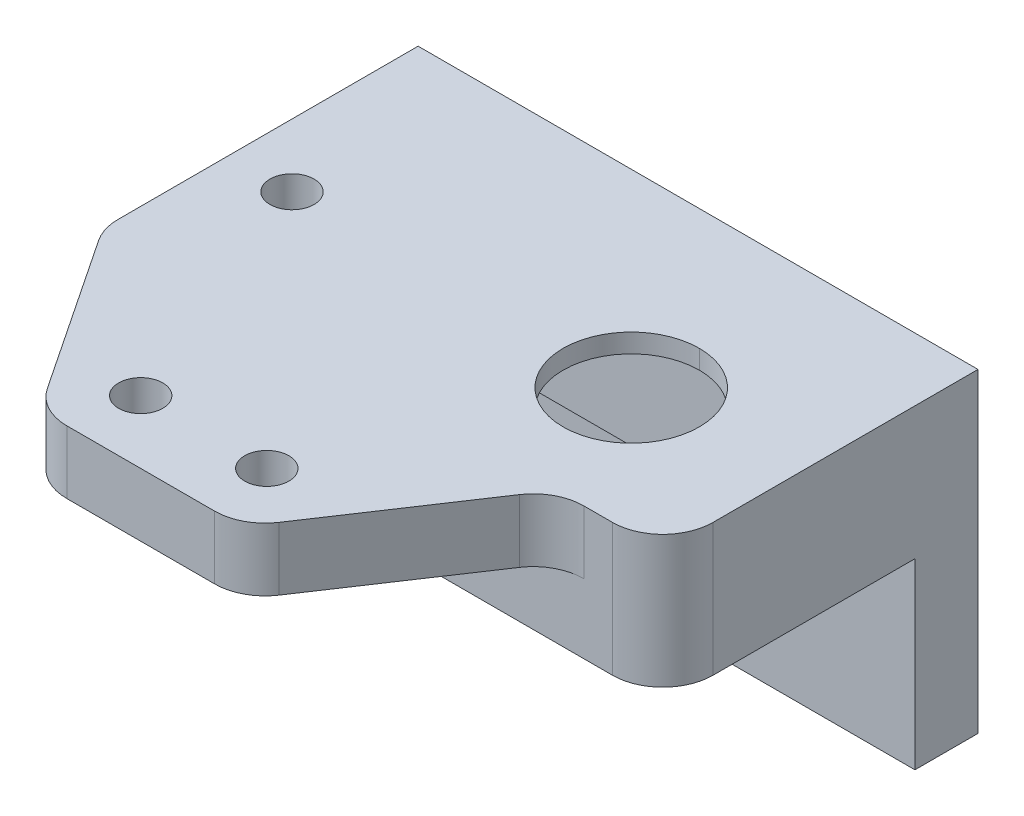
ISO-10303-21;
HEADER;
FILE_DESCRIPTION(('STEP AP214'),'2;1');
FILE_NAME('part.step','',(''),(''),'','','');
FILE_SCHEMA(('AUTOMOTIVE_DESIGN { 1 0 10303 214 1 1 1 1 }'));
ENDSEC;
DATA;
#1=APPLICATION_CONTEXT('core data for automotive mechanical design processes');
#2=APPLICATION_PROTOCOL_DEFINITION('international standard','automotive_design',2000,#1);
#3=PRODUCT_CONTEXT('',#1,'mechanical');
#4=PRODUCT('Part','Part','',(#3));
#5=PRODUCT_RELATED_PRODUCT_CATEGORY('part','',(#4));
#6=PRODUCT_DEFINITION_FORMATION('','',#4);
#7=PRODUCT_DEFINITION_CONTEXT('part definition',#1,'design');
#8=PRODUCT_DEFINITION('design','',#6,#7);
#9=PRODUCT_DEFINITION_SHAPE('','',#8);
#10=(LENGTH_UNIT() NAMED_UNIT(*) SI_UNIT(.MILLI.,.METRE.));
#11=(NAMED_UNIT(*) PLANE_ANGLE_UNIT() SI_UNIT($,.RADIAN.));
#12=(NAMED_UNIT(*) SI_UNIT($,.STERADIAN.) SOLID_ANGLE_UNIT());
#13=UNCERTAINTY_MEASURE_WITH_UNIT(LENGTH_MEASURE(1.E-05),#10,'distance_accuracy_value','');
#14=(GEOMETRIC_REPRESENTATION_CONTEXT(3) GLOBAL_UNCERTAINTY_ASSIGNED_CONTEXT((#13)) GLOBAL_UNIT_ASSIGNED_CONTEXT((#10,
#11,#12)) REPRESENTATION_CONTEXT('',''));
#15=CARTESIAN_POINT('',(0.,0.,0.));
#16=DIRECTION('',(0.,0.,1.));
#17=DIRECTION('',(1.,0.,0.));
#18=AXIS2_PLACEMENT_3D('',#15,#16,#17);
#19=CARTESIAN_POINT('',(0.,0.,0.));
#20=DIRECTION('',(0.,1.,0.));
#21=DIRECTION('',(0.,0.,1.));
#22=AXIS2_PLACEMENT_3D('',#19,#20,#21);
#23=PLANE('',#22);
#24=CARTESIAN_POINT('',(23.,0.,-5.));
#25=DIRECTION('',(0.,1.,0.));
#26=DIRECTION('',(0.,0.,1.));
#27=AXIS2_PLACEMENT_3D('',#24,#25,#26);
#28=CIRCLE('',#27,1.75);
#29=CARTESIAN_POINT('',(23.,0.,-3.25));
#30=VERTEX_POINT('',#29);
#31=EDGE_CURVE('E315',#30,#30,#28,.T.);
#32=ORIENTED_EDGE('',*,*,#31,.T.);
#33=EDGE_LOOP('',(#32));
#34=FACE_BOUND('',#33,.T.);
#35=CARTESIAN_POINT('',(13.,0.,-5.));
#36=DIRECTION('',(0.,1.,0.));
#37=DIRECTION('',(0.,0.,1.));
#38=AXIS2_PLACEMENT_3D('',#35,#36,#37);
#39=CIRCLE('',#38,1.75);
#40=CARTESIAN_POINT('',(13.,0.,-3.25));
#41=VERTEX_POINT('',#40);
#42=EDGE_CURVE('E345',#41,#41,#39,.T.);
#43=ORIENTED_EDGE('',*,*,#42,.T.);
#44=EDGE_LOOP('',(#43));
#45=FACE_BOUND('',#44,.T.);
#46=CARTESIAN_POINT('',(5.,0.,-25.));
#47=DIRECTION('',(0.,1.,0.));
#48=DIRECTION('',(0.,0.,1.));
#49=AXIS2_PLACEMENT_3D('',#46,#47,#48);
#50=CIRCLE('',#49,1.75);
#51=CARTESIAN_POINT('',(5.,0.,-23.25));
#52=VERTEX_POINT('',#51);
#53=EDGE_CURVE('E342',#52,#52,#50,.T.);
#54=ORIENTED_EDGE('',*,*,#53,.T.);
#55=EDGE_LOOP('',(#54));
#56=FACE_BOUND('',#55,.T.);
#57=DIRECTION('',(0.,0.,-1.));
#58=VECTOR('',#57,1.);
#59=CARTESIAN_POINT('',(0.,0.,0.));
#60=LINE('',#59,#58);
#61=CARTESIAN_POINT('',(0.,0.,-16.211102550928));
#62=VERTEX_POINT('',#61);
#63=CARTESIAN_POINT('',(0.,0.,-35.));
#64=VERTEX_POINT('',#63);
#65=EDGE_CURVE('E199',#62,#64,#60,.T.);
#66=ORIENTED_EDGE('',*,*,#65,.T.);
#67=DIRECTION('',(1.,0.,0.));
#68=VECTOR('',#67,1.);
#69=CARTESIAN_POINT('',(36.,0.,-35.));
#70=LINE('',#69,#68);
#71=CARTESIAN_POINT('',(9.40000000000366,0.,-35.));
#72=VERTEX_POINT('',#71);
#73=EDGE_CURVE('E202',#64,#72,#70,.T.);
#74=ORIENTED_EDGE('',*,*,#73,.T.);
#75=DIRECTION('',(0.,0.,1.));
#76=VECTOR('',#75,1.);
#77=CARTESIAN_POINT('',(9.40000000000366,0.,0.));
#78=LINE('',#77,#76);
#79=CARTESIAN_POINT('',(9.40000000000366,0.,-19.));
#80=VERTEX_POINT('',#79);
#81=EDGE_CURVE('E273',#72,#80,#78,.T.);
#82=ORIENTED_EDGE('',*,*,#81,.T.);
#83=CARTESIAN_POINT('',(13.4000000000037,0.,-19.));
#84=DIRECTION('',(0.,1.,0.));
#85=DIRECTION('',(0.,0.,1.));
#86=AXIS2_PLACEMENT_3D('',#83,#84,#85);
#87=CIRCLE('',#86,4.);
#88=CARTESIAN_POINT('',(13.4000000000037,0.,-15.));
#89=VERTEX_POINT('',#88);
#90=EDGE_CURVE('E11',#80,#89,#87,.T.);
#91=ORIENTED_EDGE('',*,*,#90,.T.);
#92=DIRECTION('',(-1.,0.,0.));
#93=VECTOR('',#92,1.);
#94=CARTESIAN_POINT('',(0.,0.,-15.));
#95=LINE('',#94,#93);
#96=CARTESIAN_POINT('',(38.140735033952,0.,-15.));
#97=VERTEX_POINT('',#96);
#98=EDGE_CURVE('E297',#97,#89,#95,.T.);
#99=ORIENTED_EDGE('',*,*,#98,.F.);
#100=CARTESIAN_POINT('',(38.140735033952,0.,-11.));
#101=DIRECTION('',(0.,1.,0.));
#102=DIRECTION('',(0.,0.,1.));
#103=AXIS2_PLACEMENT_3D('',#100,#101,#102);
#104=CIRCLE('',#103,4.);
#105=CARTESIAN_POINT('',(34.8125338566006,0.,-13.2188007849009));
#106=VERTEX_POINT('',#105);
#107=EDGE_CURVE('E409',#97,#106,#104,.T.);
#108=ORIENTED_EDGE('',*,*,#107,.T.);
#109=DIRECTION('',(0.554700196225229,0.,-0.832050294337844));
#110=VECTOR('',#109,1.);
#111=CARTESIAN_POINT('',(18.,0.,12.));
#112=LINE('',#111,#110);
#113=CARTESIAN_POINT('',(27.1874661433994,0.,-1.78119921509908));
#114=VERTEX_POINT('',#113);
#115=EDGE_CURVE('E339',#114,#106,#112,.T.);
#116=ORIENTED_EDGE('',*,*,#115,.F.);
#117=CARTESIAN_POINT('',(23.859264966048,0.,-4.));
#118=DIRECTION('',(0.,1.,0.));
#119=DIRECTION('',(0.,0.,1.));
#120=AXIS2_PLACEMENT_3D('',#117,#118,#119);
#121=CIRCLE('',#120,4.);
#122=CARTESIAN_POINT('',(23.859264966048,0.,0.));
#123=VERTEX_POINT('',#122);
#124=EDGE_CURVE('E389',#114,#123,#121,.F.);
#125=ORIENTED_EDGE('',*,*,#124,.T.);
#126=DIRECTION('',(1.,0.,0.));
#127=VECTOR('',#126,1.);
#128=CARTESIAN_POINT('',(0.,0.,0.));
#129=LINE('',#128,#127);
#130=CARTESIAN_POINT('',(12.140735033952,0.,0.));
#131=VERTEX_POINT('',#130);
#132=EDGE_CURVE('E337',#131,#123,#129,.T.);
#133=ORIENTED_EDGE('',*,*,#132,.F.);
#134=CARTESIAN_POINT('',(12.140735033952,0.,-4.));
#135=DIRECTION('',(0.,1.,0.));
#136=DIRECTION('',(0.,0.,1.));
#137=AXIS2_PLACEMENT_3D('',#134,#135,#136);
#138=CIRCLE('',#137,4.);
#139=CARTESIAN_POINT('',(8.81253385660061,0.,-1.78119921509908));
#140=VERTEX_POINT('',#139);
#141=EDGE_CURVE('E391',#131,#140,#138,.F.);
#142=ORIENTED_EDGE('',*,*,#141,.T.);
#143=DIRECTION('',(0.554700196225229,0.,0.832050294337844));
#144=VECTOR('',#143,1.);
#145=CARTESIAN_POINT('',(6.92307692307692,0.,-4.61538461538462));
#146=LINE('',#145,#144);
#147=CARTESIAN_POINT('',(0.671798822648625,0.,-13.9923017660271));
#148=VERTEX_POINT('',#147);
#149=EDGE_CURVE('E209',#148,#140,#146,.T.);
#150=ORIENTED_EDGE('',*,*,#149,.F.);
#151=CARTESIAN_POINT('',(4.,0.,-16.211102550928));
#152=DIRECTION('',(0.,1.,0.));
#153=DIRECTION('',(0.,0.,1.));
#154=AXIS2_PLACEMENT_3D('',#151,#152,#153);
#155=CIRCLE('',#154,4.);
#156=EDGE_CURVE('E205',#148,#62,#155,.F.);
#157=ORIENTED_EDGE('',*,*,#156,.T.);
#158=EDGE_LOOP('',(#66,#74,#82,#91,#99,#108,#116,#125,#133,#142,#150,#157));
#159=FACE_BOUND('',#158,.T.);
#160=ADVANCED_FACE('F37',(#34,#45,#56,#159),#23,.F.);
#161=CARTESIAN_POINT('',(0.,5.,0.));
#162=DIRECTION('',(0.,1.,0.));
#163=DIRECTION('',(0.,0.,1.));
#164=AXIS2_PLACEMENT_3D('',#161,#162,#163);
#165=PLANE('',#164);
#166=DIRECTION('',(-1.,0.,0.));
#167=VECTOR('',#166,1.);
#168=CARTESIAN_POINT('',(44.4000000000037,5.,-40.));
#169=LINE('',#168,#167);
#170=CARTESIAN_POINT('',(44.4000000000037,5.,-40.));
#171=VERTEX_POINT('',#170);
#172=CARTESIAN_POINT('',(0.,5.,-40.));
#173=VERTEX_POINT('',#172);
#174=EDGE_CURVE('E240',#171,#173,#169,.T.);
#175=ORIENTED_EDGE('',*,*,#174,.T.);
#176=DIRECTION('',(0.,0.,-1.));
#177=VECTOR('',#176,1.);
#178=CARTESIAN_POINT('',(0.,5.,0.));
#179=LINE('',#178,#177);
#180=CARTESIAN_POINT('',(0.,5.,-16.211102550928));
#181=VERTEX_POINT('',#180);
#182=EDGE_CURVE('E312',#181,#173,#179,.T.);
#183=ORIENTED_EDGE('',*,*,#182,.F.);
#184=CARTESIAN_POINT('',(4.,5.,-16.211102550928));
#185=DIRECTION('',(0.,1.,0.));
#186=DIRECTION('',(0.,0.,1.));
#187=AXIS2_PLACEMENT_3D('',#184,#185,#186);
#188=CIRCLE('',#187,4.);
#189=CARTESIAN_POINT('',(0.671798822648625,5.,-13.9923017660271));
#190=VERTEX_POINT('',#189);
#191=EDGE_CURVE('E401',#181,#190,#188,.T.);
#192=ORIENTED_EDGE('',*,*,#191,.T.);
#193=DIRECTION('',(0.554700196225229,0.,0.832050294337844));
#194=VECTOR('',#193,1.);
#195=CARTESIAN_POINT('',(6.92307692307692,5.,-4.61538461538462));
#196=LINE('',#195,#194);
#197=CARTESIAN_POINT('',(8.81253385660061,5.,-1.78119921509908));
#198=VERTEX_POINT('',#197);
#199=EDGE_CURVE('E314',#190,#198,#196,.T.);
#200=ORIENTED_EDGE('',*,*,#199,.T.);
#201=CARTESIAN_POINT('',(12.140735033952,5.,-4.));
#202=DIRECTION('',(0.,1.,0.));
#203=DIRECTION('',(0.,0.,1.));
#204=AXIS2_PLACEMENT_3D('',#201,#202,#203);
#205=CIRCLE('',#204,4.);
#206=CARTESIAN_POINT('',(12.140735033952,5.,0.));
#207=VERTEX_POINT('',#206);
#208=EDGE_CURVE('E398',#198,#207,#205,.T.);
#209=ORIENTED_EDGE('',*,*,#208,.T.);
#210=DIRECTION('',(1.,0.,0.));
#211=VECTOR('',#210,1.);
#212=CARTESIAN_POINT('',(0.,5.,0.));
#213=LINE('',#212,#211);
#214=CARTESIAN_POINT('',(23.859264966048,5.,0.));
#215=VERTEX_POINT('',#214);
#216=EDGE_CURVE('E318',#207,#215,#213,.T.);
#217=ORIENTED_EDGE('',*,*,#216,.T.);
#218=CARTESIAN_POINT('',(23.859264966048,5.,-4.));
#219=DIRECTION('',(0.,1.,0.));
#220=DIRECTION('',(0.,0.,1.));
#221=AXIS2_PLACEMENT_3D('',#218,#219,#220);
#222=CIRCLE('',#221,4.);
#223=CARTESIAN_POINT('',(27.1874661433994,5.,-1.78119921509908));
#224=VERTEX_POINT('',#223);
#225=EDGE_CURVE('E396',#215,#224,#222,.T.);
#226=ORIENTED_EDGE('',*,*,#225,.T.);
#227=DIRECTION('',(0.554700196225229,0.,-0.832050294337844));
#228=VECTOR('',#227,1.);
#229=CARTESIAN_POINT('',(18.,5.,12.));
#230=LINE('',#229,#228);
#231=CARTESIAN_POINT('',(34.8125338566006,5.,-13.2188007849009));
#232=VERTEX_POINT('',#231);
#233=EDGE_CURVE('E320',#224,#232,#230,.T.);
#234=ORIENTED_EDGE('',*,*,#233,.T.);
#235=CARTESIAN_POINT('',(38.140735033952,5.,-11.));
#236=DIRECTION('',(0.,1.,0.));
#237=DIRECTION('',(0.,0.,1.));
#238=AXIS2_PLACEMENT_3D('',#235,#236,#237);
#239=CIRCLE('',#238,4.);
#240=CARTESIAN_POINT('',(38.140735033952,5.,-15.));
#241=VERTEX_POINT('',#240);
#242=EDGE_CURVE('E45',#232,#241,#239,.F.);
#243=ORIENTED_EDGE('',*,*,#242,.T.);
#244=DIRECTION('',(1.,0.,0.));
#245=VECTOR('',#244,1.);
#246=CARTESIAN_POINT('',(0.,5.,-15.));
#247=LINE('',#246,#245);
#248=CARTESIAN_POINT('',(40.4000000000037,5.,-15.));
#249=VERTEX_POINT('',#248);
#250=EDGE_CURVE('E323',#241,#249,#247,.T.);
#251=ORIENTED_EDGE('',*,*,#250,.T.);
#252=CARTESIAN_POINT('',(40.4000000000037,5.,-19.));
#253=DIRECTION('',(0.,1.,0.));
#254=DIRECTION('',(0.,0.,1.));
#255=AXIS2_PLACEMENT_3D('',#252,#253,#254);
#256=CIRCLE('',#255,4.);
#257=CARTESIAN_POINT('',(44.4000000000037,5.,-19.));
#258=VERTEX_POINT('',#257);
#259=EDGE_CURVE('E52',#249,#258,#256,.T.);
#260=ORIENTED_EDGE('',*,*,#259,.T.);
#261=DIRECTION('',(0.,0.,-1.));
#262=VECTOR('',#261,1.);
#263=CARTESIAN_POINT('',(44.4000000000037,5.,-15.));
#264=LINE('',#263,#262);
#265=EDGE_CURVE('E247',#258,#171,#264,.T.);
#266=ORIENTED_EDGE('',*,*,#265,.T.);
#267=EDGE_LOOP('',(#175,#183,#192,#200,#209,#217,#226,#234,#243,#251,#260,#266));
#268=FACE_BOUND('',#267,.T.);
#269=CARTESIAN_POINT('',(31.9,5.,-25.));
#270=DIRECTION('',(0.,1.,0.));
#271=DIRECTION('',(0.,0.,1.));
#272=AXIS2_PLACEMENT_3D('',#269,#270,#271);
#273=CIRCLE('',#272,5.4);
#274=CARTESIAN_POINT('',(31.9,5.,-30.4));
#275=VERTEX_POINT('',#274);
#276=CARTESIAN_POINT('',(31.9,5.,-19.6));
#277=VERTEX_POINT('',#276);
#278=EDGE_CURVE('E354',#275,#277,#273,.T.);
#279=ORIENTED_EDGE('',*,*,#278,.F.);
#280=CARTESIAN_POINT('',(31.9,5.,-25.));
#281=DIRECTION('',(0.,1.,0.));
#282=DIRECTION('',(0.,0.,1.));
#283=AXIS2_PLACEMENT_3D('',#280,#281,#282);
#284=CIRCLE('',#283,5.4);
#285=CARTESIAN_POINT('',(37.3,5.,-25.));
#286=VERTEX_POINT('',#285);
#287=EDGE_CURVE('E301',#275,#286,#284,.F.);
#288=ORIENTED_EDGE('',*,*,#287,.T.);
#289=CARTESIAN_POINT('',(31.9,5.,-25.));
#290=DIRECTION('',(0.,1.,0.));
#291=DIRECTION('',(0.,0.,1.));
#292=AXIS2_PLACEMENT_3D('',#289,#290,#291);
#293=CIRCLE('',#292,5.4);
#294=EDGE_CURVE('E357',#286,#277,#293,.F.);
#295=ORIENTED_EDGE('',*,*,#294,.T.);
#296=EDGE_LOOP('',(#279,#288,#295));
#297=FACE_BOUND('',#296,.T.);
#298=CARTESIAN_POINT('',(5.,5.,-25.));
#299=DIRECTION('',(0.,1.,0.));
#300=DIRECTION('',(0.,0.,1.));
#301=AXIS2_PLACEMENT_3D('',#298,#299,#300);
#302=CIRCLE('',#301,1.75);
#303=CARTESIAN_POINT('',(5.,5.,-23.25));
#304=VERTEX_POINT('',#303);
#305=EDGE_CURVE('E325',#304,#304,#302,.T.);
#306=ORIENTED_EDGE('',*,*,#305,.F.);
#307=EDGE_LOOP('',(#306));
#308=FACE_BOUND('',#307,.T.);
#309=CARTESIAN_POINT('',(13.,5.,-5.));
#310=DIRECTION('',(0.,1.,0.));
#311=DIRECTION('',(0.,0.,1.));
#312=AXIS2_PLACEMENT_3D('',#309,#310,#311);
#313=CIRCLE('',#312,1.75);
#314=CARTESIAN_POINT('',(13.,5.,-3.25));
#315=VERTEX_POINT('',#314);
#316=EDGE_CURVE('E328',#315,#315,#313,.T.);
#317=ORIENTED_EDGE('',*,*,#316,.F.);
#318=EDGE_LOOP('',(#317));
#319=FACE_BOUND('',#318,.T.);
#320=CARTESIAN_POINT('',(23.,5.,-5.));
#321=DIRECTION('',(0.,1.,0.));
#322=DIRECTION('',(0.,0.,1.));
#323=AXIS2_PLACEMENT_3D('',#320,#321,#322);
#324=CIRCLE('',#323,1.75);
#325=CARTESIAN_POINT('',(23.,5.,-3.25));
#326=VERTEX_POINT('',#325);
#327=EDGE_CURVE('E331',#326,#326,#324,.T.);
#328=ORIENTED_EDGE('',*,*,#327,.F.);
#329=EDGE_LOOP('',(#328));
#330=FACE_BOUND('',#329,.T.);
#331=ADVANCED_FACE('F413',(#268,#297,#308,#319,#330),#165,.T.);
#332=CARTESIAN_POINT('',(31.9,0.,-25.));
#333=DIRECTION('',(0.,-1.,0.));
#334=DIRECTION('',(0.,0.,-1.));
#335=AXIS2_PLACEMENT_3D('',#332,#333,#334);
#336=CYLINDRICAL_SURFACE('',#335,5.4);
#337=CARTESIAN_POINT('',(31.9,3.5,-25.));
#338=DIRECTION('',(0.,-1.,0.));
#339=DIRECTION('',(0.,0.,-1.));
#340=AXIS2_PLACEMENT_3D('',#337,#338,#339);
#341=CIRCLE('',#340,5.4);
#342=CARTESIAN_POINT('',(31.9,3.5,-30.4));
#343=VERTEX_POINT('',#342);
#344=CARTESIAN_POINT('',(31.9,3.5,-19.6));
#345=VERTEX_POINT('',#344);
#346=EDGE_CURVE('E271',#343,#345,#341,.F.);
#347=ORIENTED_EDGE('',*,*,#346,.F.);
#348=DIRECTION('',(0.,-1.,0.));
#349=VECTOR('',#348,1.);
#350=CARTESIAN_POINT('',(31.9,5.,-30.4));
#351=LINE('',#350,#349);
#352=EDGE_CURVE('E351',#275,#343,#351,.T.);
#353=ORIENTED_EDGE('',*,*,#352,.F.);
#354=ORIENTED_EDGE('',*,*,#278,.T.);
#355=DIRECTION('',(0.,1.,0.));
#356=VECTOR('',#355,1.);
#357=CARTESIAN_POINT('',(31.9,0.,-19.6));
#358=LINE('',#357,#356);
#359=EDGE_CURVE('E333',#345,#277,#358,.T.);
#360=ORIENTED_EDGE('',*,*,#359,.F.);
#361=EDGE_LOOP('',(#347,#353,#354,#360));
#362=FACE_BOUND('',#361,.T.);
#363=ADVANCED_FACE('F491',(#362),#336,.F.);
#364=CARTESIAN_POINT('',(31.9,5.,-25.));
#365=DIRECTION('',(0.,-1.,0.));
#366=DIRECTION('',(0.,0.,-1.));
#367=AXIS2_PLACEMENT_3D('',#364,#365,#366);
#368=CYLINDRICAL_SURFACE('',#367,5.4);
#369=CARTESIAN_POINT('',(31.9,3.5,-25.));
#370=DIRECTION('',(0.,-1.,0.));
#371=DIRECTION('',(0.,0.,-1.));
#372=AXIS2_PLACEMENT_3D('',#369,#370,#371);
#373=CIRCLE('',#372,5.4);
#374=CARTESIAN_POINT('',(37.3,3.5,-25.));
#375=VERTEX_POINT('',#374);
#376=EDGE_CURVE('E269',#375,#343,#373,.F.);
#377=ORIENTED_EDGE('',*,*,#376,.F.);
#378=DIRECTION('',(0.,-1.,0.));
#379=VECTOR('',#378,1.);
#380=CARTESIAN_POINT('',(37.3,5.,-25.));
#381=LINE('',#380,#379);
#382=EDGE_CURVE('E210',#286,#375,#381,.T.);
#383=ORIENTED_EDGE('',*,*,#382,.F.);
#384=ORIENTED_EDGE('',*,*,#287,.F.);
#385=ORIENTED_EDGE('',*,*,#352,.T.);
#386=EDGE_LOOP('',(#377,#383,#384,#385));
#387=FACE_BOUND('',#386,.T.);
#388=ADVANCED_FACE('F522',(#387),#368,.F.);
#389=CARTESIAN_POINT('',(31.9,5.,-25.));
#390=DIRECTION('',(0.,1.,0.));
#391=DIRECTION('',(0.,0.,1.));
#392=AXIS2_PLACEMENT_3D('',#389,#390,#391);
#393=CYLINDRICAL_SURFACE('',#392,5.4);
#394=CARTESIAN_POINT('',(31.9,3.5,-25.));
#395=DIRECTION('',(0.,-1.,0.));
#396=DIRECTION('',(0.,0.,-1.));
#397=AXIS2_PLACEMENT_3D('',#394,#395,#396);
#398=CIRCLE('',#397,5.4);
#399=EDGE_CURVE('E300',#345,#375,#398,.F.);
#400=ORIENTED_EDGE('',*,*,#399,.F.);
#401=ORIENTED_EDGE('',*,*,#359,.T.);
#402=ORIENTED_EDGE('',*,*,#294,.F.);
#403=ORIENTED_EDGE('',*,*,#382,.T.);
#404=EDGE_LOOP('',(#400,#401,#402,#403));
#405=FACE_BOUND('',#404,.T.);
#406=ADVANCED_FACE('F519',(#405),#393,.F.);
#407=CARTESIAN_POINT('',(0.,5.,0.));
#408=DIRECTION('',(-1.,0.,0.));
#409=DIRECTION('',(0.,0.,1.));
#410=AXIS2_PLACEMENT_3D('',#407,#408,#409);
#411=PLANE('',#410);
#412=ORIENTED_EDGE('',*,*,#65,.F.);
#413=DIRECTION('',(0.,-1.,0.));
#414=VECTOR('',#413,1.);
#415=CARTESIAN_POINT('',(0.,5.,-16.211102550928));
#416=LINE('',#415,#414);
#417=EDGE_CURVE('E394',#62,#181,#416,.F.);
#418=ORIENTED_EDGE('',*,*,#417,.T.);
#419=ORIENTED_EDGE('',*,*,#182,.T.);
#420=DIRECTION('',(0.,-1.,0.));
#421=VECTOR('',#420,1.);
#422=CARTESIAN_POINT('',(0.,5.,-40.));
#423=LINE('',#422,#421);
#424=CARTESIAN_POINT('',(0.,-20.,-40.));
#425=VERTEX_POINT('',#424);
#426=EDGE_CURVE('E450',#173,#425,#423,.T.);
#427=ORIENTED_EDGE('',*,*,#426,.T.);
#428=DIRECTION('',(0.,0.,1.));
#429=VECTOR('',#428,1.);
#430=CARTESIAN_POINT('',(0.,-20.,-40.));
#431=LINE('',#430,#429);
#432=CARTESIAN_POINT('',(0.,-20.,-35.));
#433=VERTEX_POINT('',#432);
#434=EDGE_CURVE('E225',#425,#433,#431,.T.);
#435=ORIENTED_EDGE('',*,*,#434,.T.);
#436=DIRECTION('',(0.,-1.,0.));
#437=VECTOR('',#436,1.);
#438=CARTESIAN_POINT('',(0.,5.,-35.));
#439=LINE('',#438,#437);
#440=EDGE_CURVE('E215',#64,#433,#439,.T.);
#441=ORIENTED_EDGE('',*,*,#440,.F.);
#442=EDGE_LOOP('',(#412,#418,#419,#427,#435,#441));
#443=FACE_BOUND('',#442,.T.);
#444=ADVANCED_FACE('F222',(#443),#411,.T.);
#445=CARTESIAN_POINT('',(6.92307692307692,5.,-4.61538461538462));
#446=DIRECTION('',(0.832050294337844,0.,-0.554700196225229));
#447=DIRECTION('',(-0.554700196225229,0.,-0.832050294337844));
#448=AXIS2_PLACEMENT_3D('',#445,#446,#447);
#449=PLANE('',#448);
#450=ORIENTED_EDGE('',*,*,#199,.F.);
#451=DIRECTION('',(0.,-1.,0.));
#452=VECTOR('',#451,1.);
#453=CARTESIAN_POINT('',(0.671798822648625,0.,-13.9923017660271));
#454=LINE('',#453,#452);
#455=EDGE_CURVE('E386',#190,#148,#454,.T.);
#456=ORIENTED_EDGE('',*,*,#455,.T.);
#457=ORIENTED_EDGE('',*,*,#149,.T.);
#458=DIRECTION('',(0.,-1.,0.));
#459=VECTOR('',#458,1.);
#460=CARTESIAN_POINT('',(8.81253385660061,5.,-1.78119921509908));
#461=LINE('',#460,#459);
#462=EDGE_CURVE('E384',#140,#198,#461,.F.);
#463=ORIENTED_EDGE('',*,*,#462,.T.);
#464=EDGE_LOOP('',(#450,#456,#457,#463));
#465=FACE_BOUND('',#464,.T.);
#466=ADVANCED_FACE('F440',(#465),#449,.F.);
#467=CARTESIAN_POINT('',(0.,5.,0.));
#468=DIRECTION('',(0.,0.,-1.));
#469=DIRECTION('',(-1.,0.,0.));
#470=AXIS2_PLACEMENT_3D('',#467,#468,#469);
#471=PLANE('',#470);
#472=ORIENTED_EDGE('',*,*,#216,.F.);
#473=DIRECTION('',(0.,-1.,0.));
#474=VECTOR('',#473,1.);
#475=CARTESIAN_POINT('',(12.140735033952,5.,0.));
#476=LINE('',#475,#474);
#477=EDGE_CURVE('E406',#207,#131,#476,.T.);
#478=ORIENTED_EDGE('',*,*,#477,.T.);
#479=ORIENTED_EDGE('',*,*,#132,.T.);
#480=DIRECTION('',(0.,-1.,0.));
#481=VECTOR('',#480,1.);
#482=CARTESIAN_POINT('',(23.859264966048,5.,0.));
#483=LINE('',#482,#481);
#484=EDGE_CURVE('E60',#123,#215,#483,.F.);
#485=ORIENTED_EDGE('',*,*,#484,.T.);
#486=EDGE_LOOP('',(#472,#478,#479,#485));
#487=FACE_BOUND('',#486,.T.);
#488=ADVANCED_FACE('F432',(#487),#471,.F.);
#489=CARTESIAN_POINT('',(18.,5.,12.));
#490=DIRECTION('',(-0.832050294337844,0.,-0.554700196225229));
#491=DIRECTION('',(-0.554700196225229,0.,0.832050294337844));
#492=AXIS2_PLACEMENT_3D('',#489,#490,#491);
#493=PLANE('',#492);
#494=ORIENTED_EDGE('',*,*,#115,.T.);
#495=DIRECTION('',(0.,-1.,0.));
#496=VECTOR('',#495,1.);
#497=CARTESIAN_POINT('',(34.8125338566006,5.,-13.2188007849009));
#498=LINE('',#497,#496);
#499=EDGE_CURVE('E375',#106,#232,#498,.F.);
#500=ORIENTED_EDGE('',*,*,#499,.T.);
#501=ORIENTED_EDGE('',*,*,#233,.F.);
#502=DIRECTION('',(0.,-1.,0.));
#503=VECTOR('',#502,1.);
#504=CARTESIAN_POINT('',(27.1874661433994,5.,-1.78119921509908));
#505=LINE('',#504,#503);
#506=EDGE_CURVE('E372',#224,#114,#505,.T.);
#507=ORIENTED_EDGE('',*,*,#506,.T.);
#508=EDGE_LOOP('',(#494,#500,#501,#507));
#509=FACE_BOUND('',#508,.T.);
#510=ADVANCED_FACE('F427',(#509),#493,.F.);
#511=CARTESIAN_POINT('',(13.,5.,-5.));
#512=DIRECTION('',(0.,-1.,0.));
#513=DIRECTION('',(0.,0.,-1.));
#514=AXIS2_PLACEMENT_3D('',#511,#512,#513);
#515=CYLINDRICAL_SURFACE('',#514,1.75);
#516=ORIENTED_EDGE('',*,*,#316,.T.);
#517=EDGE_LOOP('',(#516));
#518=FACE_BOUND('',#517,.T.);
#519=ORIENTED_EDGE('',*,*,#42,.F.);
#520=EDGE_LOOP('',(#519));
#521=FACE_BOUND('',#520,.T.);
#522=ADVANCED_FACE('F501',(#518,#521),#515,.F.);
#523=CARTESIAN_POINT('',(5.,5.,-25.));
#524=DIRECTION('',(0.,-1.,0.));
#525=DIRECTION('',(0.,0.,-1.));
#526=AXIS2_PLACEMENT_3D('',#523,#524,#525);
#527=CYLINDRICAL_SURFACE('',#526,1.75);
#528=ORIENTED_EDGE('',*,*,#305,.T.);
#529=EDGE_LOOP('',(#528));
#530=FACE_BOUND('',#529,.T.);
#531=ORIENTED_EDGE('',*,*,#53,.F.);
#532=EDGE_LOOP('',(#531));
#533=FACE_BOUND('',#532,.T.);
#534=ADVANCED_FACE('F504',(#530,#533),#527,.F.);
#535=CARTESIAN_POINT('',(0.,5.,-15.));
#536=DIRECTION('',(0.,0.,-1.));
#537=DIRECTION('',(-1.,0.,0.));
#538=AXIS2_PLACEMENT_3D('',#535,#536,#537);
#539=PLANE('',#538);
#540=ORIENTED_EDGE('',*,*,#250,.F.);
#541=DIRECTION('',(0.,-1.,0.));
#542=VECTOR('',#541,1.);
#543=CARTESIAN_POINT('',(38.140735033952,0.,-15.));
#544=LINE('',#543,#542);
#545=EDGE_CURVE('E369',#241,#97,#544,.T.);
#546=ORIENTED_EDGE('',*,*,#545,.T.);
#547=ORIENTED_EDGE('',*,*,#98,.T.);
#548=DIRECTION('',(0.,1.,0.));
#549=VECTOR('',#548,1.);
#550=CARTESIAN_POINT('',(13.4000000000037,-5.5,-15.));
#551=LINE('',#550,#549);
#552=CARTESIAN_POINT('',(13.4000000000037,-5.5,-15.));
#553=VERTEX_POINT('',#552);
#554=EDGE_CURVE('E367',#89,#553,#551,.F.);
#555=ORIENTED_EDGE('',*,*,#554,.T.);
#556=DIRECTION('',(-1.,0.,0.));
#557=VECTOR('',#556,1.);
#558=CARTESIAN_POINT('',(0.,-5.5,-15.));
#559=LINE('',#558,#557);
#560=CARTESIAN_POINT('',(40.4000000000037,-5.5,-15.));
#561=VERTEX_POINT('',#560);
#562=EDGE_CURVE('E280',#561,#553,#559,.T.);
#563=ORIENTED_EDGE('',*,*,#562,.F.);
#564=DIRECTION('',(0.,1.,0.));
#565=VECTOR('',#564,1.);
#566=CARTESIAN_POINT('',(40.4000000000037,5.,-15.));
#567=LINE('',#566,#565);
#568=EDGE_CURVE('E364',#561,#249,#567,.T.);
#569=ORIENTED_EDGE('',*,*,#568,.T.);
#570=EDGE_LOOP('',(#540,#546,#547,#555,#563,#569));
#571=FACE_BOUND('',#570,.T.);
#572=ADVANCED_FACE('F420',(#571),#539,.F.);
#573=CARTESIAN_POINT('',(23.,5.,-5.));
#574=DIRECTION('',(0.,-1.,0.));
#575=DIRECTION('',(0.,0.,-1.));
#576=AXIS2_PLACEMENT_3D('',#573,#574,#575);
#577=CYLINDRICAL_SURFACE('',#576,1.75);
#578=ORIENTED_EDGE('',*,*,#327,.T.);
#579=EDGE_LOOP('',(#578));
#580=FACE_BOUND('',#579,.T.);
#581=ORIENTED_EDGE('',*,*,#31,.F.);
#582=EDGE_LOOP('',(#581));
#583=FACE_BOUND('',#582,.T.);
#584=ADVANCED_FACE('F496',(#580,#583),#577,.F.);
#585=CARTESIAN_POINT('',(38.4000000000037,-5.5,0.));
#586=DIRECTION('',(-1.,0.,0.));
#587=DIRECTION('',(0.,0.,1.));
#588=AXIS2_PLACEMENT_3D('',#585,#586,#587);
#589=PLANE('',#588);
#590=DIRECTION('',(0.,1.,0.));
#591=VECTOR('',#590,1.);
#592=CARTESIAN_POINT('',(38.4000000000037,-5.5,-18.5000000000006));
#593=LINE('',#592,#591);
#594=CARTESIAN_POINT('',(38.4000000000037,-5.5,-18.5000000000006));
#595=VERTEX_POINT('',#594);
#596=CARTESIAN_POINT('',(38.4000000000036,3.5,-18.5000000000006));
#597=VERTEX_POINT('',#596);
#598=EDGE_CURVE('E303',#595,#597,#593,.T.);
#599=ORIENTED_EDGE('',*,*,#598,.T.);
#600=DIRECTION('',(0.,0.,-1.));
#601=VECTOR('',#600,1.);
#602=CARTESIAN_POINT('',(38.4000000000036,3.5,-18.5000000000006));
#603=LINE('',#602,#601);
#604=CARTESIAN_POINT('',(38.4000000000037,3.5,-31.5000000000006));
#605=VERTEX_POINT('',#604);
#606=EDGE_CURVE('E263',#597,#605,#603,.T.);
#607=ORIENTED_EDGE('',*,*,#606,.T.);
#608=DIRECTION('',(0.,1.,0.));
#609=VECTOR('',#608,1.);
#610=CARTESIAN_POINT('',(38.4000000000037,-5.5,-31.5000000000006));
#611=LINE('',#610,#609);
#612=CARTESIAN_POINT('',(38.4000000000037,-5.5,-31.5000000000006));
#613=VERTEX_POINT('',#612);
#614=EDGE_CURVE('E309',#613,#605,#611,.T.);
#615=ORIENTED_EDGE('',*,*,#614,.F.);
#616=DIRECTION('',(0.,0.,1.));
#617=VECTOR('',#616,1.);
#618=CARTESIAN_POINT('',(38.4000000000037,-5.5,0.));
#619=LINE('',#618,#617);
#620=EDGE_CURVE('E286',#613,#595,#619,.T.);
#621=ORIENTED_EDGE('',*,*,#620,.T.);
#622=EDGE_LOOP('',(#599,#607,#615,#621));
#623=FACE_BOUND('',#622,.T.);
#624=ADVANCED_FACE('F499',(#623),#589,.T.);
#625=CARTESIAN_POINT('',(0.,-5.5,-31.5000000000006));
#626=DIRECTION('',(0.,0.,1.));
#627=DIRECTION('',(1.,0.,0.));
#628=AXIS2_PLACEMENT_3D('',#625,#626,#627);
#629=PLANE('',#628);
#630=ORIENTED_EDGE('',*,*,#614,.T.);
#631=DIRECTION('',(1.,0.,0.));
#632=VECTOR('',#631,1.);
#633=CARTESIAN_POINT('',(15.4000000000037,3.5,-31.5000000000006));
#634=LINE('',#633,#632);
#635=CARTESIAN_POINT('',(15.4000000000037,3.5,-31.5000000000006));
#636=VERTEX_POINT('',#635);
#637=EDGE_CURVE('E260',#636,#605,#634,.T.);
#638=ORIENTED_EDGE('',*,*,#637,.F.);
#639=DIRECTION('',(0.,1.,0.));
#640=VECTOR('',#639,1.);
#641=CARTESIAN_POINT('',(15.4000000000037,-5.5,-31.5000000000006));
#642=LINE('',#641,#640);
#643=CARTESIAN_POINT('',(15.4000000000037,-5.5,-31.5000000000006));
#644=VERTEX_POINT('',#643);
#645=EDGE_CURVE('E307',#644,#636,#642,.T.);
#646=ORIENTED_EDGE('',*,*,#645,.F.);
#647=DIRECTION('',(1.,0.,0.));
#648=VECTOR('',#647,1.);
#649=CARTESIAN_POINT('',(0.,-5.5,-31.5000000000006));
#650=LINE('',#649,#648);
#651=EDGE_CURVE('E289',#644,#613,#650,.T.);
#652=ORIENTED_EDGE('',*,*,#651,.T.);
#653=EDGE_LOOP('',(#630,#638,#646,#652));
#654=FACE_BOUND('',#653,.T.);
#655=ADVANCED_FACE('F726',(#654),#629,.T.);
#656=CARTESIAN_POINT('',(15.4000000000037,-5.5,0.));
#657=DIRECTION('',(-1.,0.,0.));
#658=DIRECTION('',(0.,0.,1.));
#659=AXIS2_PLACEMENT_3D('',#656,#657,#658);
#660=PLANE('',#659);
#661=ORIENTED_EDGE('',*,*,#645,.T.);
#662=DIRECTION('',(0.,0.,-1.));
#663=VECTOR('',#662,1.);
#664=CARTESIAN_POINT('',(15.4000000000037,3.5,-18.5000000000006));
#665=LINE('',#664,#663);
#666=CARTESIAN_POINT('',(15.4000000000037,3.5,-18.5000000000006));
#667=VERTEX_POINT('',#666);
#668=EDGE_CURVE('E257',#667,#636,#665,.T.);
#669=ORIENTED_EDGE('',*,*,#668,.F.);
#670=DIRECTION('',(0.,1.,0.));
#671=VECTOR('',#670,1.);
#672=CARTESIAN_POINT('',(15.4000000000037,-5.5,-18.5000000000006));
#673=LINE('',#672,#671);
#674=CARTESIAN_POINT('',(15.4000000000037,-5.5,-18.5000000000006));
#675=VERTEX_POINT('',#674);
#676=EDGE_CURVE('E305',#675,#667,#673,.T.);
#677=ORIENTED_EDGE('',*,*,#676,.F.);
#678=DIRECTION('',(0.,0.,1.));
#679=VECTOR('',#678,1.);
#680=CARTESIAN_POINT('',(15.4000000000037,-5.5,0.));
#681=LINE('',#680,#679);
#682=EDGE_CURVE('E292',#644,#675,#681,.T.);
#683=ORIENTED_EDGE('',*,*,#682,.F.);
#684=EDGE_LOOP('',(#661,#669,#677,#683));
#685=FACE_BOUND('',#684,.T.);
#686=ADVANCED_FACE('F571',(#685),#660,.F.);
#687=CARTESIAN_POINT('',(44.4000000000037,-5.5,0.));
#688=DIRECTION('',(-1.,0.,0.));
#689=DIRECTION('',(0.,0.,1.));
#690=AXIS2_PLACEMENT_3D('',#687,#688,#689);
#691=PLANE('',#690);
#692=ORIENTED_EDGE('',*,*,#265,.F.);
#693=DIRECTION('',(0.,1.,0.));
#694=VECTOR('',#693,1.);
#695=CARTESIAN_POINT('',(44.4000000000037,-5.5,-19.));
#696=LINE('',#695,#694);
#697=CARTESIAN_POINT('',(44.4000000000037,-5.5,-19.));
#698=VERTEX_POINT('',#697);
#699=EDGE_CURVE('E403',#258,#698,#696,.F.);
#700=ORIENTED_EDGE('',*,*,#699,.T.);
#701=DIRECTION('',(0.,0.,1.));
#702=VECTOR('',#701,1.);
#703=CARTESIAN_POINT('',(44.4000000000037,-5.5,0.));
#704=LINE('',#703,#702);
#705=CARTESIAN_POINT('',(44.4000000000037,-5.5,-35.));
#706=VERTEX_POINT('',#705);
#707=EDGE_CURVE('E277',#706,#698,#704,.T.);
#708=ORIENTED_EDGE('',*,*,#707,.F.);
#709=DIRECTION('',(0.,-1.,0.));
#710=VECTOR('',#709,1.);
#711=CARTESIAN_POINT('',(44.4000000000037,5.,-35.));
#712=LINE('',#711,#710);
#713=CARTESIAN_POINT('',(44.4000000000037,-20.,-35.));
#714=VERTEX_POINT('',#713);
#715=EDGE_CURVE('E230',#706,#714,#712,.T.);
#716=ORIENTED_EDGE('',*,*,#715,.T.);
#717=DIRECTION('',(0.,0.,1.));
#718=VECTOR('',#717,1.);
#719=CARTESIAN_POINT('',(44.4000000000037,-20.,-40.));
#720=LINE('',#719,#718);
#721=CARTESIAN_POINT('',(44.4000000000037,-20.,-40.));
#722=VERTEX_POINT('',#721);
#723=EDGE_CURVE('E220',#722,#714,#720,.T.);
#724=ORIENTED_EDGE('',*,*,#723,.F.);
#725=DIRECTION('',(0.,-1.,0.));
#726=VECTOR('',#725,1.);
#727=CARTESIAN_POINT('',(44.4000000000037,5.,-40.));
#728=LINE('',#727,#726);
#729=EDGE_CURVE('E236',#171,#722,#728,.T.);
#730=ORIENTED_EDGE('',*,*,#729,.F.);
#731=EDGE_LOOP('',(#692,#700,#708,#716,#724,#730));
#732=FACE_BOUND('',#731,.T.);
#733=ADVANCED_FACE('F459',(#732),#691,.F.);
#734=CARTESIAN_POINT('',(9.40000000000366,-5.5,0.));
#735=DIRECTION('',(-1.,0.,0.));
#736=DIRECTION('',(0.,0.,1.));
#737=AXIS2_PLACEMENT_3D('',#734,#735,#736);
#738=PLANE('',#737);
#739=DIRECTION('',(0.,0.,1.));
#740=VECTOR('',#739,1.);
#741=CARTESIAN_POINT('',(9.40000000000366,-5.5,0.));
#742=LINE('',#741,#740);
#743=CARTESIAN_POINT('',(9.40000000000366,-5.5,-35.0000000000013));
#744=VERTEX_POINT('',#743);
#745=CARTESIAN_POINT('',(9.40000000000366,-5.5,-19.));
#746=VERTEX_POINT('',#745);
#747=EDGE_CURVE('E283',#744,#746,#742,.T.);
#748=ORIENTED_EDGE('',*,*,#747,.T.);
#749=DIRECTION('',(0.,1.,0.));
#750=VECTOR('',#749,1.);
#751=CARTESIAN_POINT('',(9.40000000000366,0.,-19.));
#752=LINE('',#751,#750);
#753=EDGE_CURVE('E377',#746,#80,#752,.T.);
#754=ORIENTED_EDGE('',*,*,#753,.T.);
#755=ORIENTED_EDGE('',*,*,#81,.F.);
#756=DIRECTION('',(0.,1.,0.));
#757=VECTOR('',#756,1.);
#758=CARTESIAN_POINT('',(9.40000000000366,-5.5,-35.0000000000013));
#759=LINE('',#758,#757);
#760=EDGE_CURVE('E218',#744,#72,#759,.T.);
#761=ORIENTED_EDGE('',*,*,#760,.F.);
#762=EDGE_LOOP('',(#748,#754,#755,#761));
#763=FACE_BOUND('',#762,.T.);
#764=ADVANCED_FACE('F472',(#763),#738,.T.);
#765=CARTESIAN_POINT('',(0.,-5.5,-18.5000000000006));
#766=DIRECTION('',(0.,0.,1.));
#767=DIRECTION('',(1.,0.,0.));
#768=AXIS2_PLACEMENT_3D('',#765,#766,#767);
#769=PLANE('',#768);
#770=ORIENTED_EDGE('',*,*,#676,.T.);
#771=DIRECTION('',(1.,0.,0.));
#772=VECTOR('',#771,1.);
#773=CARTESIAN_POINT('',(15.4000000000037,3.5,-18.5000000000006));
#774=LINE('',#773,#772);
#775=EDGE_CURVE('E266',#667,#597,#774,.T.);
#776=ORIENTED_EDGE('',*,*,#775,.T.);
#777=ORIENTED_EDGE('',*,*,#598,.F.);
#778=DIRECTION('',(1.,0.,0.));
#779=VECTOR('',#778,1.);
#780=CARTESIAN_POINT('',(0.,-5.5,-18.5000000000006));
#781=LINE('',#780,#779);
#782=EDGE_CURVE('E295',#675,#595,#781,.T.);
#783=ORIENTED_EDGE('',*,*,#782,.F.);
#784=EDGE_LOOP('',(#770,#776,#777,#783));
#785=FACE_BOUND('',#784,.T.);
#786=ADVANCED_FACE('F582',(#785),#769,.F.);
#787=CARTESIAN_POINT('',(0.,-5.5,0.));
#788=DIRECTION('',(0.,-1.,0.));
#789=DIRECTION('',(0.,0.,-1.));
#790=AXIS2_PLACEMENT_3D('',#787,#788,#789);
#791=PLANE('',#790);
#792=CARTESIAN_POINT('',(13.1000000000037,-5.5,-25.0000000000006));
#793=DIRECTION('',(0.,-1.,0.));
#794=DIRECTION('',(0.,0.,-1.));
#795=AXIS2_PLACEMENT_3D('',#792,#793,#794);
#796=CIRCLE('',#795,1.);
#797=CARTESIAN_POINT('',(13.1000000000037,-5.5,-26.0000000000007));
#798=VERTEX_POINT('',#797);
#799=EDGE_CURVE('E248',#798,#798,#796,.T.);
#800=ORIENTED_EDGE('',*,*,#799,.F.);
#801=EDGE_LOOP('',(#800));
#802=FACE_BOUND('',#801,.T.);
#803=CARTESIAN_POINT('',(40.7000000000037,-5.5,-25.0000000000006));
#804=DIRECTION('',(0.,-1.,0.));
#805=DIRECTION('',(0.,0.,-1.));
#806=AXIS2_PLACEMENT_3D('',#803,#804,#805);
#807=CIRCLE('',#806,0.999999999999998);
#808=CARTESIAN_POINT('',(40.7000000000037,-5.5,-26.0000000000006));
#809=VERTEX_POINT('',#808);
#810=EDGE_CURVE('E219',#809,#809,#807,.T.);
#811=ORIENTED_EDGE('',*,*,#810,.F.);
#812=EDGE_LOOP('',(#811));
#813=FACE_BOUND('',#812,.T.);
#814=ORIENTED_EDGE('',*,*,#562,.T.);
#815=CARTESIAN_POINT('',(13.4000000000037,-5.5,-19.));
#816=DIRECTION('',(0.,-1.,0.));
#817=DIRECTION('',(0.,0.,-1.));
#818=AXIS2_PLACEMENT_3D('',#815,#816,#817);
#819=CIRCLE('',#818,4.);
#820=EDGE_CURVE('E382',#553,#746,#819,.T.);
#821=ORIENTED_EDGE('',*,*,#820,.T.);
#822=ORIENTED_EDGE('',*,*,#747,.F.);
#823=DIRECTION('',(1.,0.,0.));
#824=VECTOR('',#823,1.);
#825=CARTESIAN_POINT('',(0.,-5.5,-35.0000000000013));
#826=LINE('',#825,#824);
#827=EDGE_CURVE('E274',#744,#706,#826,.T.);
#828=ORIENTED_EDGE('',*,*,#827,.T.);
#829=ORIENTED_EDGE('',*,*,#707,.T.);
#830=CARTESIAN_POINT('',(40.4000000000037,-5.5,-19.));
#831=DIRECTION('',(0.,-1.,0.));
#832=DIRECTION('',(0.,0.,-1.));
#833=AXIS2_PLACEMENT_3D('',#830,#831,#832);
#834=CIRCLE('',#833,4.);
#835=EDGE_CURVE('E380',#698,#561,#834,.T.);
#836=ORIENTED_EDGE('',*,*,#835,.T.);
#837=EDGE_LOOP('',(#814,#821,#822,#828,#829,#836));
#838=FACE_BOUND('',#837,.T.);
#839=ORIENTED_EDGE('',*,*,#620,.F.);
#840=ORIENTED_EDGE('',*,*,#651,.F.);
#841=ORIENTED_EDGE('',*,*,#682,.T.);
#842=ORIENTED_EDGE('',*,*,#782,.T.);
#843=EDGE_LOOP('',(#839,#840,#841,#842));
#844=FACE_BOUND('',#843,.T.);
#845=ADVANCED_FACE('F467',(#802,#813,#838,#844),#791,.T.);
#846=CARTESIAN_POINT('',(0.,3.5,0.));
#847=DIRECTION('',(0.,-1.,0.));
#848=DIRECTION('',(0.,0.,-1.));
#849=AXIS2_PLACEMENT_3D('',#846,#847,#848);
#850=PLANE('',#849);
#851=ORIENTED_EDGE('',*,*,#668,.T.);
#852=ORIENTED_EDGE('',*,*,#637,.T.);
#853=ORIENTED_EDGE('',*,*,#606,.F.);
#854=ORIENTED_EDGE('',*,*,#775,.F.);
#855=EDGE_LOOP('',(#851,#852,#853,#854));
#856=FACE_BOUND('',#855,.T.);
#857=ORIENTED_EDGE('',*,*,#346,.T.);
#858=ORIENTED_EDGE('',*,*,#399,.T.);
#859=ORIENTED_EDGE('',*,*,#376,.T.);
#860=EDGE_LOOP('',(#857,#858,#859));
#861=FACE_BOUND('',#860,.T.);
#862=ADVANCED_FACE('F594',(#856,#861),#850,.T.);
#863=CARTESIAN_POINT('',(40.7000000000037,1.5,-25.0000000000006));
#864=DIRECTION('',(0.,-1.,0.));
#865=DIRECTION('',(0.,0.,-1.));
#866=AXIS2_PLACEMENT_3D('',#863,#864,#865);
#867=CYLINDRICAL_SURFACE('',#866,0.999999999999998);
#868=CARTESIAN_POINT('',(40.7000000000037,1.5,-25.0000000000006));
#869=DIRECTION('',(0.,-1.,0.));
#870=DIRECTION('',(0.,0.,-1.));
#871=AXIS2_PLACEMENT_3D('',#868,#869,#870);
#872=CIRCLE('',#871,0.999999999999998);
#873=CARTESIAN_POINT('',(40.7000000000037,1.5,-26.0000000000006));
#874=VERTEX_POINT('',#873);
#875=EDGE_CURVE('E251',#874,#874,#872,.T.);
#876=ORIENTED_EDGE('',*,*,#875,.F.);
#877=EDGE_LOOP('',(#876));
#878=FACE_BOUND('',#877,.T.);
#879=ORIENTED_EDGE('',*,*,#810,.T.);
#880=EDGE_LOOP('',(#879));
#881=FACE_BOUND('',#880,.T.);
#882=ADVANCED_FACE('F716',(#878,#881),#867,.F.);
#883=CARTESIAN_POINT('',(40.7000000000037,1.5,-25.0000000000006));
#884=DIRECTION('',(0.,-1.,0.));
#885=DIRECTION('',(0.,0.,-1.));
#886=AXIS2_PLACEMENT_3D('',#883,#884,#885);
#887=PLANE('',#886);
#888=ORIENTED_EDGE('',*,*,#875,.T.);
#889=EDGE_LOOP('',(#888));
#890=FACE_BOUND('',#889,.T.);
#891=ADVANCED_FACE('F712',(#890),#887,.T.);
#892=CARTESIAN_POINT('',(13.1000000000037,1.5,-25.0000000000006));
#893=DIRECTION('',(0.,-1.,0.));
#894=DIRECTION('',(0.,0.,-1.));
#895=AXIS2_PLACEMENT_3D('',#892,#893,#894);
#896=CYLINDRICAL_SURFACE('',#895,1.);
#897=CARTESIAN_POINT('',(13.1000000000037,1.5,-25.0000000000006));
#898=DIRECTION('',(0.,-1.,0.));
#899=DIRECTION('',(0.,0.,-1.));
#900=AXIS2_PLACEMENT_3D('',#897,#898,#899);
#901=CIRCLE('',#900,1.);
#902=CARTESIAN_POINT('',(13.1000000000037,1.5,-26.0000000000007));
#903=VERTEX_POINT('',#902);
#904=EDGE_CURVE('E244',#903,#903,#901,.T.);
#905=ORIENTED_EDGE('',*,*,#904,.F.);
#906=EDGE_LOOP('',(#905));
#907=FACE_BOUND('',#906,.T.);
#908=ORIENTED_EDGE('',*,*,#799,.T.);
#909=EDGE_LOOP('',(#908));
#910=FACE_BOUND('',#909,.T.);
#911=ADVANCED_FACE('F708',(#907,#910),#896,.F.);
#912=CARTESIAN_POINT('',(13.1000000000037,1.5,-25.0000000000006));
#913=DIRECTION('',(0.,-1.,0.));
#914=DIRECTION('',(0.,0.,-1.));
#915=AXIS2_PLACEMENT_3D('',#912,#913,#914);
#916=PLANE('',#915);
#917=ORIENTED_EDGE('',*,*,#904,.T.);
#918=EDGE_LOOP('',(#917));
#919=FACE_BOUND('',#918,.T.);
#920=ADVANCED_FACE('F532',(#919),#916,.T.);
#921=CARTESIAN_POINT('',(38.140735033952,5.,-11.));
#922=DIRECTION('',(0.,1.,0.));
#923=DIRECTION('',(0.,0.,1.));
#924=AXIS2_PLACEMENT_3D('',#921,#922,#923);
#925=CYLINDRICAL_SURFACE('',#924,4.);
#926=ORIENTED_EDGE('',*,*,#242,.F.);
#927=ORIENTED_EDGE('',*,*,#499,.F.);
#928=ORIENTED_EDGE('',*,*,#107,.F.);
#929=ORIENTED_EDGE('',*,*,#545,.F.);
#930=EDGE_LOOP('',(#926,#927,#928,#929));
#931=FACE_BOUND('',#930,.T.);
#932=ADVANCED_FACE('F424',(#931),#925,.F.);
#933=CARTESIAN_POINT('',(13.4000000000037,-5.5,-19.));
#934=DIRECTION('',(0.,-1.,0.));
#935=DIRECTION('',(0.,0.,-1.));
#936=AXIS2_PLACEMENT_3D('',#933,#934,#935);
#937=CYLINDRICAL_SURFACE('',#936,4.);
#938=ORIENTED_EDGE('',*,*,#820,.F.);
#939=ORIENTED_EDGE('',*,*,#554,.F.);
#940=ORIENTED_EDGE('',*,*,#90,.F.);
#941=ORIENTED_EDGE('',*,*,#753,.F.);
#942=EDGE_LOOP('',(#938,#939,#940,#941));
#943=FACE_BOUND('',#942,.T.);
#944=ADVANCED_FACE('F474',(#943),#937,.T.);
#945=CARTESIAN_POINT('',(4.,5.,-16.211102550928));
#946=DIRECTION('',(0.,1.,0.));
#947=DIRECTION('',(0.,0.,1.));
#948=AXIS2_PLACEMENT_3D('',#945,#946,#947);
#949=CYLINDRICAL_SURFACE('',#948,4.);
#950=ORIENTED_EDGE('',*,*,#191,.F.);
#951=ORIENTED_EDGE('',*,*,#417,.F.);
#952=ORIENTED_EDGE('',*,*,#156,.F.);
#953=ORIENTED_EDGE('',*,*,#455,.F.);
#954=EDGE_LOOP('',(#950,#951,#952,#953));
#955=FACE_BOUND('',#954,.T.);
#956=ADVANCED_FACE('F444',(#955),#949,.T.);
#957=CARTESIAN_POINT('',(40.4000000000037,5.,-19.));
#958=DIRECTION('',(0.,1.,0.));
#959=DIRECTION('',(0.,0.,1.));
#960=AXIS2_PLACEMENT_3D('',#957,#958,#959);
#961=CYLINDRICAL_SURFACE('',#960,4.);
#962=ORIENTED_EDGE('',*,*,#835,.F.);
#963=ORIENTED_EDGE('',*,*,#699,.F.);
#964=ORIENTED_EDGE('',*,*,#259,.F.);
#965=ORIENTED_EDGE('',*,*,#568,.F.);
#966=EDGE_LOOP('',(#962,#963,#964,#965));
#967=FACE_BOUND('',#966,.T.);
#968=ADVANCED_FACE('F477',(#967),#961,.T.);
#969=CARTESIAN_POINT('',(12.140735033952,5.,-4.));
#970=DIRECTION('',(0.,-1.,0.));
#971=DIRECTION('',(0.,0.,-1.));
#972=AXIS2_PLACEMENT_3D('',#969,#970,#971);
#973=CYLINDRICAL_SURFACE('',#972,4.);
#974=ORIENTED_EDGE('',*,*,#208,.F.);
#975=ORIENTED_EDGE('',*,*,#462,.F.);
#976=ORIENTED_EDGE('',*,*,#141,.F.);
#977=ORIENTED_EDGE('',*,*,#477,.F.);
#978=EDGE_LOOP('',(#974,#975,#976,#977));
#979=FACE_BOUND('',#978,.T.);
#980=ADVANCED_FACE('F436',(#979),#973,.T.);
#981=CARTESIAN_POINT('',(23.859264966048,5.,-4.));
#982=DIRECTION('',(0.,-1.,0.));
#983=DIRECTION('',(0.,0.,-1.));
#984=AXIS2_PLACEMENT_3D('',#981,#982,#983);
#985=CYLINDRICAL_SURFACE('',#984,4.);
#986=ORIENTED_EDGE('',*,*,#225,.F.);
#987=ORIENTED_EDGE('',*,*,#484,.F.);
#988=ORIENTED_EDGE('',*,*,#124,.F.);
#989=ORIENTED_EDGE('',*,*,#506,.F.);
#990=EDGE_LOOP('',(#986,#987,#988,#989));
#991=FACE_BOUND('',#990,.T.);
#992=ADVANCED_FACE('F39',(#991),#985,.T.);
#993=CARTESIAN_POINT('',(0.,0.,-35.));
#994=DIRECTION('',(0.,0.,1.));
#995=DIRECTION('',(1.,0.,0.));
#996=AXIS2_PLACEMENT_3D('',#993,#994,#995);
#997=PLANE('',#996);
#998=CARTESIAN_POINT('',(26.,-15.5,-35.));
#999=DIRECTION('',(0.,0.,1.));
#1000=DIRECTION('',(1.,0.,0.));
#1001=AXIS2_PLACEMENT_3D('',#998,#999,#1000);
#1002=CIRCLE('',#1001,0.750000000000002);
#1003=CARTESIAN_POINT('',(26.75,-15.5,-35.));
#1004=VERTEX_POINT('',#1003);
#1005=EDGE_CURVE('E977',#1004,#1004,#1002,.F.);
#1006=ORIENTED_EDGE('',*,*,#1005,.T.);
#1007=EDGE_LOOP('',(#1006));
#1008=FACE_BOUND('',#1007,.T.);
#1009=CARTESIAN_POINT('',(10.,-15.5,-35.));
#1010=DIRECTION('',(0.,0.,1.));
#1011=DIRECTION('',(1.,0.,0.));
#1012=AXIS2_PLACEMENT_3D('',#1009,#1010,#1011);
#1013=CIRCLE('',#1012,0.75);
#1014=CARTESIAN_POINT('',(10.75,-15.5,-35.));
#1015=VERTEX_POINT('',#1014);
#1016=EDGE_CURVE('E981',#1015,#1015,#1013,.F.);
#1017=ORIENTED_EDGE('',*,*,#1016,.T.);
#1018=EDGE_LOOP('',(#1017));
#1019=FACE_BOUND('',#1018,.T.);
#1020=ORIENTED_EDGE('',*,*,#73,.F.);
#1021=ORIENTED_EDGE('',*,*,#440,.T.);
#1022=DIRECTION('',(-1.,0.,0.));
#1023=VECTOR('',#1022,1.);
#1024=CARTESIAN_POINT('',(44.4000000000037,-20.,-35.));
#1025=LINE('',#1024,#1023);
#1026=EDGE_CURVE('E227',#714,#433,#1025,.T.);
#1027=ORIENTED_EDGE('',*,*,#1026,.F.);
#1028=ORIENTED_EDGE('',*,*,#715,.F.);
#1029=ORIENTED_EDGE('',*,*,#827,.F.);
#1030=ORIENTED_EDGE('',*,*,#760,.T.);
#1031=EDGE_LOOP('',(#1020,#1021,#1027,#1028,#1029,#1030));
#1032=FACE_BOUND('',#1031,.T.);
#1033=ADVANCED_FACE('F213',(#1008,#1019,#1032),#997,.T.);
#1034=CARTESIAN_POINT('',(44.4000000000037,-20.,-40.));
#1035=DIRECTION('',(0.,1.,0.));
#1036=DIRECTION('',(0.,0.,1.));
#1037=AXIS2_PLACEMENT_3D('',#1034,#1035,#1036);
#1038=PLANE('',#1037);
#1039=ORIENTED_EDGE('',*,*,#1026,.T.);
#1040=ORIENTED_EDGE('',*,*,#434,.F.);
#1041=DIRECTION('',(-1.,0.,0.));
#1042=VECTOR('',#1041,1.);
#1043=CARTESIAN_POINT('',(44.4000000000037,-20.,-40.));
#1044=LINE('',#1043,#1042);
#1045=EDGE_CURVE('E452',#722,#425,#1044,.T.);
#1046=ORIENTED_EDGE('',*,*,#1045,.F.);
#1047=ORIENTED_EDGE('',*,*,#723,.T.);
#1048=EDGE_LOOP('',(#1039,#1040,#1046,#1047));
#1049=FACE_BOUND('',#1048,.T.);
#1050=ADVANCED_FACE('F462',(#1049),#1038,.F.);
#1051=CARTESIAN_POINT('',(0.,0.,-40.));
#1052=DIRECTION('',(0.,0.,1.));
#1053=DIRECTION('',(1.,0.,0.));
#1054=AXIS2_PLACEMENT_3D('',#1051,#1052,#1053);
#1055=PLANE('',#1054);
#1056=CARTESIAN_POINT('',(26.,-15.5,-40.));
#1057=DIRECTION('',(0.,0.,-1.));
#1058=DIRECTION('',(-1.,0.,0.));
#1059=AXIS2_PLACEMENT_3D('',#1056,#1057,#1058);
#1060=CIRCLE('',#1059,0.750000000000002);
#1061=CARTESIAN_POINT('',(25.25,-15.5,-40.));
#1062=VERTEX_POINT('',#1061);
#1063=EDGE_CURVE('E974',#1062,#1062,#1060,.T.);
#1064=ORIENTED_EDGE('',*,*,#1063,.F.);
#1065=EDGE_LOOP('',(#1064));
#1066=FACE_BOUND('',#1065,.T.);
#1067=CARTESIAN_POINT('',(10.,-15.5,-40.));
#1068=DIRECTION('',(0.,0.,-1.));
#1069=DIRECTION('',(-1.,0.,0.));
#1070=AXIS2_PLACEMENT_3D('',#1067,#1068,#1069);
#1071=CIRCLE('',#1070,0.75);
#1072=CARTESIAN_POINT('',(9.25,-15.5,-40.));
#1073=VERTEX_POINT('',#1072);
#1074=EDGE_CURVE('E978',#1073,#1073,#1071,.T.);
#1075=ORIENTED_EDGE('',*,*,#1074,.F.);
#1076=EDGE_LOOP('',(#1075));
#1077=FACE_BOUND('',#1076,.T.);
#1078=CARTESIAN_POINT('',(10.,0.500000000000001,-40.));
#1079=DIRECTION('',(0.,0.,-1.));
#1080=DIRECTION('',(-1.,0.,0.));
#1081=AXIS2_PLACEMENT_3D('',#1078,#1079,#1080);
#1082=CIRCLE('',#1081,0.75);
#1083=CARTESIAN_POINT('',(9.25,0.500000000000001,-40.));
#1084=VERTEX_POINT('',#1083);
#1085=EDGE_CURVE('E989',#1084,#1084,#1082,.T.);
#1086=ORIENTED_EDGE('',*,*,#1085,.F.);
#1087=EDGE_LOOP('',(#1086));
#1088=FACE_BOUND('',#1087,.T.);
#1089=CARTESIAN_POINT('',(26.,0.499999999999999,-40.));
#1090=DIRECTION('',(0.,0.,-1.));
#1091=DIRECTION('',(-1.,0.,0.));
#1092=AXIS2_PLACEMENT_3D('',#1089,#1090,#1091);
#1093=CIRCLE('',#1092,0.750000000000002);
#1094=CARTESIAN_POINT('',(25.25,0.499999999999999,-40.));
#1095=VERTEX_POINT('',#1094);
#1096=EDGE_CURVE('E233',#1095,#1095,#1093,.T.);
#1097=ORIENTED_EDGE('',*,*,#1096,.F.);
#1098=EDGE_LOOP('',(#1097));
#1099=FACE_BOUND('',#1098,.T.);
#1100=ORIENTED_EDGE('',*,*,#174,.F.);
#1101=ORIENTED_EDGE('',*,*,#729,.T.);
#1102=ORIENTED_EDGE('',*,*,#1045,.T.);
#1103=ORIENTED_EDGE('',*,*,#426,.F.);
#1104=EDGE_LOOP('',(#1100,#1101,#1102,#1103));
#1105=FACE_BOUND('',#1104,.T.);
#1106=ADVANCED_FACE('F457',(#1066,#1077,#1088,#1099,#1105),#1055,.F.);
#1107=CARTESIAN_POINT('',(0.,0.,-35.));
#1108=DIRECTION('',(0.,0.,1.));
#1109=DIRECTION('',(1.,0.,0.));
#1110=AXIS2_PLACEMENT_3D('',#1107,#1108,#1109);
#1111=PLANE('',#1110);
#1112=CARTESIAN_POINT('',(26.,0.499999999999999,-35.));
#1113=DIRECTION('',(0.,0.,1.));
#1114=DIRECTION('',(1.,0.,0.));
#1115=AXIS2_PLACEMENT_3D('',#1112,#1113,#1114);
#1116=CIRCLE('',#1115,0.750000000000002);
#1117=CARTESIAN_POINT('',(26.75,0.499999999999999,-35.));
#1118=VERTEX_POINT('',#1117);
#1119=EDGE_CURVE('E228',#1118,#1118,#1116,.F.);
#1120=ORIENTED_EDGE('',*,*,#1119,.T.);
#1121=EDGE_LOOP('',(#1120));
#1122=FACE_BOUND('',#1121,.T.);
#1123=ADVANCED_FACE('F641',(#1122),#1111,.F.);
#1124=CARTESIAN_POINT('',(26.,0.499999999999999,-32.8786796564403));
#1125=DIRECTION('',(0.,0.,-1.));
#1126=DIRECTION('',(-1.,0.,0.));
#1127=AXIS2_PLACEMENT_3D('',#1124,#1125,#1126);
#1128=CYLINDRICAL_SURFACE('',#1127,0.750000000000002);
#1129=ORIENTED_EDGE('',*,*,#1096,.T.);
#1130=EDGE_LOOP('',(#1129));
#1131=FACE_BOUND('',#1130,.T.);
#1132=ORIENTED_EDGE('',*,*,#1119,.F.);
#1133=EDGE_LOOP('',(#1132));
#1134=FACE_BOUND('',#1133,.T.);
#1135=ADVANCED_FACE('F650',(#1131,#1134),#1128,.F.);
#1136=CARTESIAN_POINT('',(0.,0.,-35.));
#1137=DIRECTION('',(0.,0.,1.));
#1138=DIRECTION('',(1.,0.,0.));
#1139=AXIS2_PLACEMENT_3D('',#1136,#1137,#1138);
#1140=PLANE('',#1139);
#1141=CARTESIAN_POINT('',(10.,0.500000000000001,-35.));
#1142=DIRECTION('',(0.,0.,1.));
#1143=DIRECTION('',(1.,0.,0.));
#1144=AXIS2_PLACEMENT_3D('',#1141,#1142,#1143);
#1145=CIRCLE('',#1144,0.75);
#1146=CARTESIAN_POINT('',(10.75,0.500000000000001,-35.));
#1147=VERTEX_POINT('',#1146);
#1148=EDGE_CURVE('E986',#1147,#1147,#1145,.F.);
#1149=ORIENTED_EDGE('',*,*,#1148,.T.);
#1150=EDGE_LOOP('',(#1149));
#1151=FACE_BOUND('',#1150,.T.);
#1152=ADVANCED_FACE('F660',(#1151),#1140,.F.);
#1153=CARTESIAN_POINT('',(10.,0.500000000000001,-32.8786796564403));
#1154=DIRECTION('',(0.,0.,-1.));
#1155=DIRECTION('',(-1.,0.,0.));
#1156=AXIS2_PLACEMENT_3D('',#1153,#1154,#1155);
#1157=CYLINDRICAL_SURFACE('',#1156,0.75);
#1158=ORIENTED_EDGE('',*,*,#1085,.T.);
#1159=EDGE_LOOP('',(#1158));
#1160=FACE_BOUND('',#1159,.T.);
#1161=ORIENTED_EDGE('',*,*,#1148,.F.);
#1162=EDGE_LOOP('',(#1161));
#1163=FACE_BOUND('',#1162,.T.);
#1164=ADVANCED_FACE('F670',(#1160,#1163),#1157,.F.);
#1165=CARTESIAN_POINT('',(10.,-15.5,-32.8786796564403));
#1166=DIRECTION('',(0.,0.,-1.));
#1167=DIRECTION('',(-1.,0.,0.));
#1168=AXIS2_PLACEMENT_3D('',#1165,#1166,#1167);
#1169=CYLINDRICAL_SURFACE('',#1168,0.75);
#1170=ORIENTED_EDGE('',*,*,#1074,.T.);
#1171=EDGE_LOOP('',(#1170));
#1172=FACE_BOUND('',#1171,.T.);
#1173=ORIENTED_EDGE('',*,*,#1016,.F.);
#1174=EDGE_LOOP('',(#1173));
#1175=FACE_BOUND('',#1174,.T.);
#1176=ADVANCED_FACE('F680',(#1172,#1175),#1169,.F.);
#1177=CARTESIAN_POINT('',(26.,-15.5,-32.8786796564403));
#1178=DIRECTION('',(0.,0.,-1.));
#1179=DIRECTION('',(-1.,0.,0.));
#1180=AXIS2_PLACEMENT_3D('',#1177,#1178,#1179);
#1181=CYLINDRICAL_SURFACE('',#1180,0.750000000000002);
#1182=ORIENTED_EDGE('',*,*,#1063,.T.);
#1183=EDGE_LOOP('',(#1182));
#1184=FACE_BOUND('',#1183,.T.);
#1185=ORIENTED_EDGE('',*,*,#1005,.F.);
#1186=EDGE_LOOP('',(#1185));
#1187=FACE_BOUND('',#1186,.T.);
#1188=ADVANCED_FACE('F690',(#1184,#1187),#1181,.F.);
#1189=CLOSED_SHELL('',(#160,#331,#363,#388,#406,#444,#466,#488,#510,#522,#534,#572,#584,#624,
#655,#686,#733,#764,#786,#845,#862,#882,#891,#911,#920,#932,#944,#956,#968,#980,#992,#1033,
#1050,#1106,#1123,#1135,#1152,#1164,#1176,#1188));
#1190=MANIFOLD_SOLID_BREP('B2',#1189);
#1191=ADVANCED_BREP_SHAPE_REPRESENTATION('',(#18,#1190),#14);
#1192=SHAPE_DEFINITION_REPRESENTATION(#9,#1191);
ENDSEC;
END-ISO-10303-21;
